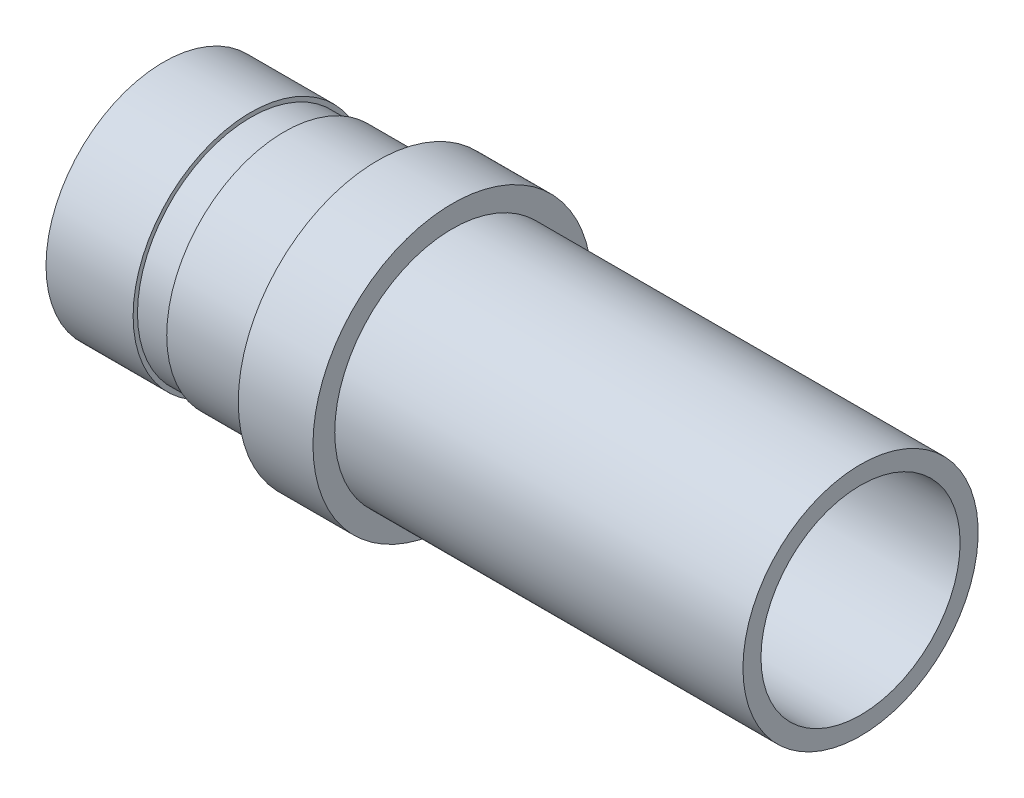
ISO-10303-21;
HEADER;
FILE_DESCRIPTION(('STEP AP214'),'2;1');
FILE_NAME('part.step','',(''),(''),'','','');
FILE_SCHEMA(('AUTOMOTIVE_DESIGN { 1 0 10303 214 1 1 1 1 }'));
ENDSEC;
DATA;
#1=APPLICATION_CONTEXT('core data for automotive mechanical design processes');
#2=APPLICATION_PROTOCOL_DEFINITION('international standard','automotive_design',2000,#1);
#3=PRODUCT_CONTEXT('',#1,'mechanical');
#4=PRODUCT('Part','Part','',(#3));
#5=PRODUCT_RELATED_PRODUCT_CATEGORY('part','',(#4));
#6=PRODUCT_DEFINITION_FORMATION('','',#4);
#7=PRODUCT_DEFINITION_CONTEXT('part definition',#1,'design');
#8=PRODUCT_DEFINITION('design','',#6,#7);
#9=PRODUCT_DEFINITION_SHAPE('','',#8);
#10=(LENGTH_UNIT() NAMED_UNIT(*) SI_UNIT(.MILLI.,.METRE.));
#11=(NAMED_UNIT(*) PLANE_ANGLE_UNIT() SI_UNIT($,.RADIAN.));
#12=(NAMED_UNIT(*) SI_UNIT($,.STERADIAN.) SOLID_ANGLE_UNIT());
#13=UNCERTAINTY_MEASURE_WITH_UNIT(LENGTH_MEASURE(1.E-05),#10,'distance_accuracy_value','');
#14=(GEOMETRIC_REPRESENTATION_CONTEXT(3) GLOBAL_UNCERTAINTY_ASSIGNED_CONTEXT((#13)) GLOBAL_UNIT_ASSIGNED_CONTEXT((#10,
#11,#12)) REPRESENTATION_CONTEXT('',''));
#15=CARTESIAN_POINT('',(0.,0.,0.));
#16=DIRECTION('',(0.,0.,1.));
#17=DIRECTION('',(1.,0.,0.));
#18=AXIS2_PLACEMENT_3D('',#15,#16,#17);
#19=CARTESIAN_POINT('',(0.,4.725,0.));
#20=DIRECTION('',(1.,0.,0.));
#21=DIRECTION('',(0.,0.,-1.));
#22=AXIS2_PLACEMENT_3D('',#19,#20,#21);
#23=PLANE('',#22);
#24=CARTESIAN_POINT('',(0.,0.,0.));
#25=DIRECTION('',(-1.,0.,0.));
#26=DIRECTION('',(0.,0.,1.));
#27=AXIS2_PLACEMENT_3D('',#24,#25,#26);
#28=CIRCLE('',#27,4.);
#29=CARTESIAN_POINT('',(0.,0.,4.));
#30=VERTEX_POINT('',#29);
#31=EDGE_CURVE('E10',#30,#30,#28,.T.);
#32=ORIENTED_EDGE('',*,*,#31,.F.);
#33=EDGE_LOOP('',(#32));
#34=FACE_BOUND('',#33,.T.);
#35=CARTESIAN_POINT('',(0.,0.,0.));
#36=DIRECTION('',(-1.,0.,0.));
#37=DIRECTION('',(0.,0.,1.));
#38=AXIS2_PLACEMENT_3D('',#35,#36,#37);
#39=CIRCLE('',#38,4.725);
#40=CARTESIAN_POINT('',(0.,0.,4.725));
#41=VERTEX_POINT('',#40);
#42=EDGE_CURVE('E68',#41,#41,#39,.T.);
#43=ORIENTED_EDGE('',*,*,#42,.T.);
#44=EDGE_LOOP('',(#43));
#45=FACE_BOUND('',#44,.T.);
#46=ADVANCED_FACE('F28',(#34,#45),#23,.F.);
#47=CARTESIAN_POINT('',(0.,0.,0.));
#48=DIRECTION('',(-1.,0.,0.));
#49=DIRECTION('',(0.,0.,1.));
#50=AXIS2_PLACEMENT_3D('',#47,#48,#49);
#51=CYLINDRICAL_SURFACE('',#50,4.);
#52=CARTESIAN_POINT('',(28.,0.,0.));
#53=DIRECTION('',(-1.,0.,0.));
#54=DIRECTION('',(0.,0.,1.));
#55=AXIS2_PLACEMENT_3D('',#52,#53,#54);
#56=CIRCLE('',#55,4.);
#57=CARTESIAN_POINT('',(28.,0.,4.));
#58=VERTEX_POINT('',#57);
#59=EDGE_CURVE('E34',#58,#58,#56,.T.);
#60=ORIENTED_EDGE('',*,*,#59,.F.);
#61=EDGE_LOOP('',(#60));
#62=FACE_BOUND('',#61,.T.);
#63=ORIENTED_EDGE('',*,*,#31,.T.);
#64=EDGE_LOOP('',(#63));
#65=FACE_BOUND('',#64,.T.);
#66=ADVANCED_FACE('F129',(#62,#65),#51,.F.);
#67=CARTESIAN_POINT('',(28.,4.725,0.));
#68=DIRECTION('',(-1.,0.,0.));
#69=DIRECTION('',(0.,0.,1.));
#70=AXIS2_PLACEMENT_3D('',#67,#68,#69);
#71=PLANE('',#70);
#72=CARTESIAN_POINT('',(28.,0.,0.));
#73=DIRECTION('',(-1.,0.,0.));
#74=DIRECTION('',(0.,0.,1.));
#75=AXIS2_PLACEMENT_3D('',#72,#73,#74);
#76=CIRCLE('',#75,4.725);
#77=CARTESIAN_POINT('',(28.,0.,4.725));
#78=VERTEX_POINT('',#77);
#79=EDGE_CURVE('E38',#78,#78,#76,.T.);
#80=ORIENTED_EDGE('',*,*,#79,.F.);
#81=EDGE_LOOP('',(#80));
#82=FACE_BOUND('',#81,.T.);
#83=ORIENTED_EDGE('',*,*,#59,.T.);
#84=EDGE_LOOP('',(#83));
#85=FACE_BOUND('',#84,.T.);
#86=ADVANCED_FACE('F124',(#82,#85),#71,.F.);
#87=CARTESIAN_POINT('',(0.,0.,0.));
#88=DIRECTION('',(-1.,0.,0.));
#89=DIRECTION('',(0.,0.,1.));
#90=AXIS2_PLACEMENT_3D('',#87,#88,#89);
#91=CYLINDRICAL_SURFACE('',#90,4.725);
#92=CARTESIAN_POINT('',(11.6,0.,0.));
#93=DIRECTION('',(-1.,0.,0.));
#94=DIRECTION('',(0.,0.,1.));
#95=AXIS2_PLACEMENT_3D('',#92,#93,#94);
#96=CIRCLE('',#95,4.725);
#97=CARTESIAN_POINT('',(11.6,0.,4.725));
#98=VERTEX_POINT('',#97);
#99=EDGE_CURVE('E42',#98,#98,#96,.T.);
#100=ORIENTED_EDGE('',*,*,#99,.F.);
#101=EDGE_LOOP('',(#100));
#102=FACE_BOUND('',#101,.T.);
#103=ORIENTED_EDGE('',*,*,#79,.T.);
#104=EDGE_LOOP('',(#103));
#105=FACE_BOUND('',#104,.T.);
#106=ADVANCED_FACE('F118',(#102,#105),#91,.T.);
#107=CARTESIAN_POINT('',(11.6,5.6,0.));
#108=DIRECTION('',(-1.,0.,0.));
#109=DIRECTION('',(0.,0.,1.));
#110=AXIS2_PLACEMENT_3D('',#107,#108,#109);
#111=PLANE('',#110);
#112=CARTESIAN_POINT('',(11.6,0.,0.));
#113=DIRECTION('',(-1.,0.,0.));
#114=DIRECTION('',(0.,0.,1.));
#115=AXIS2_PLACEMENT_3D('',#112,#113,#114);
#116=CIRCLE('',#115,5.6);
#117=CARTESIAN_POINT('',(11.6,0.,5.6));
#118=VERTEX_POINT('',#117);
#119=EDGE_CURVE('E47',#118,#118,#116,.T.);
#120=ORIENTED_EDGE('',*,*,#119,.F.);
#121=EDGE_LOOP('',(#120));
#122=FACE_BOUND('',#121,.T.);
#123=ORIENTED_EDGE('',*,*,#99,.T.);
#124=EDGE_LOOP('',(#123));
#125=FACE_BOUND('',#124,.T.);
#126=ADVANCED_FACE('F112',(#122,#125),#111,.F.);
#127=CARTESIAN_POINT('',(0.,0.,0.));
#128=DIRECTION('',(-1.,0.,0.));
#129=DIRECTION('',(0.,0.,1.));
#130=AXIS2_PLACEMENT_3D('',#127,#128,#129);
#131=CYLINDRICAL_SURFACE('',#130,5.6);
#132=CARTESIAN_POINT('',(8.6,0.,0.));
#133=DIRECTION('',(-1.,0.,0.));
#134=DIRECTION('',(0.,0.,1.));
#135=AXIS2_PLACEMENT_3D('',#132,#133,#134);
#136=CIRCLE('',#135,5.6);
#137=CARTESIAN_POINT('',(8.6,0.,5.6));
#138=VERTEX_POINT('',#137);
#139=EDGE_CURVE('E50',#138,#138,#136,.T.);
#140=ORIENTED_EDGE('',*,*,#139,.F.);
#141=EDGE_LOOP('',(#140));
#142=FACE_BOUND('',#141,.T.);
#143=ORIENTED_EDGE('',*,*,#119,.T.);
#144=EDGE_LOOP('',(#143));
#145=FACE_BOUND('',#144,.T.);
#146=ADVANCED_FACE('F106',(#142,#145),#131,.T.);
#147=CARTESIAN_POINT('',(8.6,4.725,0.));
#148=DIRECTION('',(1.,0.,0.));
#149=DIRECTION('',(0.,0.,-1.));
#150=AXIS2_PLACEMENT_3D('',#147,#148,#149);
#151=PLANE('',#150);
#152=CARTESIAN_POINT('',(8.6,0.,0.));
#153=DIRECTION('',(-1.,0.,0.));
#154=DIRECTION('',(0.,0.,1.));
#155=AXIS2_PLACEMENT_3D('',#152,#153,#154);
#156=CIRCLE('',#155,4.725);
#157=CARTESIAN_POINT('',(8.6,0.,4.725));
#158=VERTEX_POINT('',#157);
#159=EDGE_CURVE('E53',#158,#158,#156,.T.);
#160=ORIENTED_EDGE('',*,*,#159,.F.);
#161=EDGE_LOOP('',(#160));
#162=FACE_BOUND('',#161,.T.);
#163=ORIENTED_EDGE('',*,*,#139,.T.);
#164=EDGE_LOOP('',(#163));
#165=FACE_BOUND('',#164,.T.);
#166=ADVANCED_FACE('F100',(#162,#165),#151,.F.);
#167=CARTESIAN_POINT('',(0.,0.,0.));
#168=DIRECTION('',(-1.,0.,0.));
#169=DIRECTION('',(0.,0.,1.));
#170=AXIS2_PLACEMENT_3D('',#167,#168,#169);
#171=CYLINDRICAL_SURFACE('',#170,4.725);
#172=CARTESIAN_POINT('',(4.85,0.,0.));
#173=DIRECTION('',(-1.,0.,0.));
#174=DIRECTION('',(0.,0.,1.));
#175=AXIS2_PLACEMENT_3D('',#172,#173,#174);
#176=CIRCLE('',#175,4.725);
#177=CARTESIAN_POINT('',(4.85,0.,4.725));
#178=VERTEX_POINT('',#177);
#179=EDGE_CURVE('E56',#178,#178,#176,.T.);
#180=ORIENTED_EDGE('',*,*,#179,.F.);
#181=EDGE_LOOP('',(#180));
#182=FACE_BOUND('',#181,.T.);
#183=ORIENTED_EDGE('',*,*,#159,.T.);
#184=EDGE_LOOP('',(#183));
#185=FACE_BOUND('',#184,.T.);
#186=ADVANCED_FACE('F94',(#182,#185),#171,.T.);
#187=CARTESIAN_POINT('',(4.85,4.55,0.));
#188=DIRECTION('',(1.,0.,0.));
#189=DIRECTION('',(0.,0.,-1.));
#190=AXIS2_PLACEMENT_3D('',#187,#188,#189);
#191=PLANE('',#190);
#192=CARTESIAN_POINT('',(4.85,0.,0.));
#193=DIRECTION('',(-1.,0.,0.));
#194=DIRECTION('',(0.,0.,1.));
#195=AXIS2_PLACEMENT_3D('',#192,#193,#194);
#196=CIRCLE('',#195,4.55);
#197=CARTESIAN_POINT('',(4.85,0.,4.55));
#198=VERTEX_POINT('',#197);
#199=EDGE_CURVE('E59',#198,#198,#196,.T.);
#200=ORIENTED_EDGE('',*,*,#199,.F.);
#201=EDGE_LOOP('',(#200));
#202=FACE_BOUND('',#201,.T.);
#203=ORIENTED_EDGE('',*,*,#179,.T.);
#204=EDGE_LOOP('',(#203));
#205=FACE_BOUND('',#204,.T.);
#206=ADVANCED_FACE('F88',(#202,#205),#191,.F.);
#207=CARTESIAN_POINT('',(0.,0.,0.));
#208=DIRECTION('',(-1.,0.,0.));
#209=DIRECTION('',(0.,0.,1.));
#210=AXIS2_PLACEMENT_3D('',#207,#208,#209);
#211=CYLINDRICAL_SURFACE('',#210,4.55);
#212=CARTESIAN_POINT('',(3.5,0.,0.));
#213=DIRECTION('',(-1.,0.,0.));
#214=DIRECTION('',(0.,0.,1.));
#215=AXIS2_PLACEMENT_3D('',#212,#213,#214);
#216=CIRCLE('',#215,4.55);
#217=CARTESIAN_POINT('',(3.5,0.,4.55));
#218=VERTEX_POINT('',#217);
#219=EDGE_CURVE('E62',#218,#218,#216,.T.);
#220=ORIENTED_EDGE('',*,*,#219,.F.);
#221=EDGE_LOOP('',(#220));
#222=FACE_BOUND('',#221,.T.);
#223=ORIENTED_EDGE('',*,*,#199,.T.);
#224=EDGE_LOOP('',(#223));
#225=FACE_BOUND('',#224,.T.);
#226=ADVANCED_FACE('F82',(#222,#225),#211,.T.);
#227=CARTESIAN_POINT('',(3.5,4.725,0.));
#228=DIRECTION('',(-1.,0.,0.));
#229=DIRECTION('',(0.,0.,1.));
#230=AXIS2_PLACEMENT_3D('',#227,#228,#229);
#231=PLANE('',#230);
#232=CARTESIAN_POINT('',(3.5,0.,0.));
#233=DIRECTION('',(-1.,0.,0.));
#234=DIRECTION('',(0.,0.,1.));
#235=AXIS2_PLACEMENT_3D('',#232,#233,#234);
#236=CIRCLE('',#235,4.725);
#237=CARTESIAN_POINT('',(3.5,0.,4.725));
#238=VERTEX_POINT('',#237);
#239=EDGE_CURVE('E65',#238,#238,#236,.T.);
#240=ORIENTED_EDGE('',*,*,#239,.F.);
#241=EDGE_LOOP('',(#240));
#242=FACE_BOUND('',#241,.T.);
#243=ORIENTED_EDGE('',*,*,#219,.T.);
#244=EDGE_LOOP('',(#243));
#245=FACE_BOUND('',#244,.T.);
#246=ADVANCED_FACE('F76',(#242,#245),#231,.F.);
#247=CARTESIAN_POINT('',(0.,0.,0.));
#248=DIRECTION('',(-1.,0.,0.));
#249=DIRECTION('',(0.,0.,1.));
#250=AXIS2_PLACEMENT_3D('',#247,#248,#249);
#251=CYLINDRICAL_SURFACE('',#250,4.725);
#252=ORIENTED_EDGE('',*,*,#42,.F.);
#253=EDGE_LOOP('',(#252));
#254=FACE_BOUND('',#253,.T.);
#255=ORIENTED_EDGE('',*,*,#239,.T.);
#256=EDGE_LOOP('',(#255));
#257=FACE_BOUND('',#256,.T.);
#258=ADVANCED_FACE('F73',(#254,#257),#251,.T.);
#259=CLOSED_SHELL('',(#46,#66,#86,#106,#126,#146,#166,#186,#206,#226,#246,#258));
#260=MANIFOLD_SOLID_BREP('B2',#259);
#261=ADVANCED_BREP_SHAPE_REPRESENTATION('',(#18,#260),#14);
#262=SHAPE_DEFINITION_REPRESENTATION(#9,#261);
ENDSEC;
END-ISO-10303-21;
